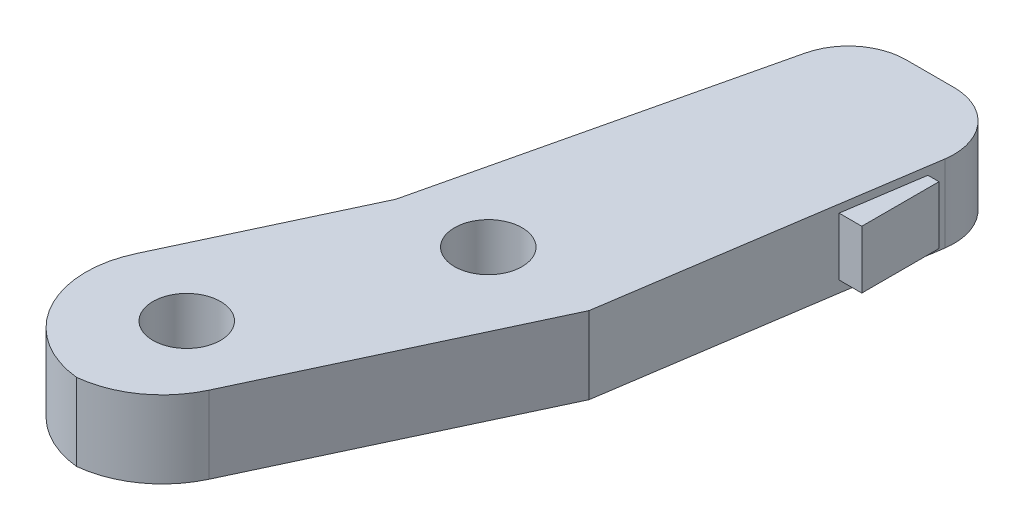
ISO-10303-21;
HEADER;
FILE_DESCRIPTION(('STEP AP214'),'2;1');
FILE_NAME('part.step','',(''),(''),'','','');
FILE_SCHEMA(('AUTOMOTIVE_DESIGN { 1 0 10303 214 1 1 1 1 }'));
ENDSEC;
DATA;
#1=APPLICATION_CONTEXT('core data for automotive mechanical design processes');
#2=APPLICATION_PROTOCOL_DEFINITION('international standard','automotive_design',2000,#1);
#3=PRODUCT_CONTEXT('',#1,'mechanical');
#4=PRODUCT('Part','Part','',(#3));
#5=PRODUCT_RELATED_PRODUCT_CATEGORY('part','',(#4));
#6=PRODUCT_DEFINITION_FORMATION('','',#4);
#7=PRODUCT_DEFINITION_CONTEXT('part definition',#1,'design');
#8=PRODUCT_DEFINITION('design','',#6,#7);
#9=PRODUCT_DEFINITION_SHAPE('','',#8);
#10=(LENGTH_UNIT() NAMED_UNIT(*) SI_UNIT(.MILLI.,.METRE.));
#11=(NAMED_UNIT(*) PLANE_ANGLE_UNIT() SI_UNIT($,.RADIAN.));
#12=(NAMED_UNIT(*) SI_UNIT($,.STERADIAN.) SOLID_ANGLE_UNIT());
#13=UNCERTAINTY_MEASURE_WITH_UNIT(LENGTH_MEASURE(1.E-05),#10,'distance_accuracy_value','');
#14=(GEOMETRIC_REPRESENTATION_CONTEXT(3) GLOBAL_UNCERTAINTY_ASSIGNED_CONTEXT((#13)) GLOBAL_UNIT_ASSIGNED_CONTEXT((#10,
#11,#12)) REPRESENTATION_CONTEXT('',''));
#15=CARTESIAN_POINT('',(0.,0.,0.));
#16=DIRECTION('',(0.,0.,1.));
#17=DIRECTION('',(1.,0.,0.));
#18=AXIS2_PLACEMENT_3D('',#15,#16,#17);
#19=CARTESIAN_POINT('',(17.6273199706348,4.,-16.3041096066469));
#20=DIRECTION('',(-0.905783867035938,0.,-0.423739998368602));
#21=DIRECTION('',(-0.423739998368602,0.,0.905783867035938));
#22=AXIS2_PLACEMENT_3D('',#19,#20,#21);
#23=PLANE('',#22);
#24=DIRECTION('',(0.423739998368602,0.,-0.905783867035938));
#25=VECTOR('',#24,1.);
#26=CARTESIAN_POINT('',(17.6273199706348,4.,-16.3041096066469));
#27=LINE('',#26,#25);
#28=CARTESIAN_POINT('',(11.3479176492194,4.,-2.88130000815699));
#29=VERTEX_POINT('',#28);
#30=CARTESIAN_POINT('',(17.6273199706348,4.,-16.3041096066469));
#31=VERTEX_POINT('',#30);
#32=EDGE_CURVE('E189',#29,#31,#27,.T.);
#33=ORIENTED_EDGE('',*,*,#32,.F.);
#34=DIRECTION('',(0.,-1.,0.));
#35=VECTOR('',#34,1.);
#36=CARTESIAN_POINT('',(11.3479176492194,4.,-2.88130000815699));
#37=LINE('',#36,#35);
#38=CARTESIAN_POINT('',(11.3479176492194,0.,-2.88130000815699));
#39=VERTEX_POINT('',#38);
#40=EDGE_CURVE('E231',#29,#39,#37,.T.);
#41=ORIENTED_EDGE('',*,*,#40,.T.);
#42=DIRECTION('',(0.423739998368602,0.,-0.905783867035938));
#43=VECTOR('',#42,1.);
#44=CARTESIAN_POINT('',(17.6273199706348,0.,-16.3041096066469));
#45=LINE('',#44,#43);
#46=CARTESIAN_POINT('',(17.6273199706348,0.,-16.3041096066469));
#47=VERTEX_POINT('',#46);
#48=EDGE_CURVE('E208',#39,#47,#45,.T.);
#49=ORIENTED_EDGE('',*,*,#48,.T.);
#50=DIRECTION('',(0.,-1.,0.));
#51=VECTOR('',#50,1.);
#52=CARTESIAN_POINT('',(17.6273199706348,4.,-16.3041096066469));
#53=LINE('',#52,#51);
#54=EDGE_CURVE('E227',#31,#47,#53,.T.);
#55=ORIENTED_EDGE('',*,*,#54,.F.);
#56=EDGE_LOOP('',(#33,#41,#49,#55));
#57=FACE_BOUND('',#56,.T.);
#58=ADVANCED_FACE('F39',(#57),#23,.F.);
#59=CARTESIAN_POINT('',(17.6273199706348,4.,-16.3041096066469));
#60=DIRECTION('',(-0.988843676353999,0.,-0.148956986189662));
#61=DIRECTION('',(-0.148956986189662,0.,0.988843676353999));
#62=AXIS2_PLACEMENT_3D('',#59,#60,#61);
#63=PLANE('',#62);
#64=DIRECTION('',(0.,-1.,0.));
#65=VECTOR('',#64,1.);
#66=CARTESIAN_POINT('',(19.3230465241798,3.5919262154066,-27.5611074970548));
#67=LINE('',#66,#65);
#68=CARTESIAN_POINT('',(19.3230465241798,3.5919262154066,-27.5611074970548));
#69=VERTEX_POINT('',#68);
#70=CARTESIAN_POINT('',(19.3230465241798,0.591926215406602,-27.5611074970548));
#71=VERTEX_POINT('',#70);
#72=EDGE_CURVE('E139',#69,#71,#67,.T.);
#73=ORIENTED_EDGE('',*,*,#72,.F.);
#74=DIRECTION('',(-0.148956986189662,0.,0.988843676353999));
#75=VECTOR('',#74,1.);
#76=CARTESIAN_POINT('',(19.8073452196943,3.5919262154066,-30.7761007295052));
#77=LINE('',#76,#75);
#78=CARTESIAN_POINT('',(19.9255967138676,3.5919262154066,-31.5611074970548));
#79=VERTEX_POINT('',#78);
#80=EDGE_CURVE('E146',#79,#69,#77,.T.);
#81=ORIENTED_EDGE('',*,*,#80,.F.);
#82=DIRECTION('',(0.,1.,0.));
#83=VECTOR('',#82,1.);
#84=CARTESIAN_POINT('',(19.9255967138676,3.5919262154066,-31.5611074970548));
#85=LINE('',#84,#83);
#86=CARTESIAN_POINT('',(19.9255967138676,0.591926215406602,-31.5611074970548));
#87=VERTEX_POINT('',#86);
#88=EDGE_CURVE('E168',#87,#79,#85,.T.);
#89=ORIENTED_EDGE('',*,*,#88,.F.);
#90=DIRECTION('',(0.148956986189662,0.,-0.988843676353999));
#91=VECTOR('',#90,1.);
#92=CARTESIAN_POINT('',(19.8073452196943,0.591926215406602,-30.7761007295052));
#93=LINE('',#92,#91);
#94=EDGE_CURVE('E55',#71,#87,#93,.T.);
#95=ORIENTED_EDGE('',*,*,#94,.F.);
#96=EDGE_LOOP('',(#73,#81,#89,#95));
#97=FACE_BOUND('',#96,.T.);
#98=DIRECTION('',(0.148956986189662,0.,-0.988843676353999));
#99=VECTOR('',#98,1.);
#100=CARTESIAN_POINT('',(17.6273199706348,0.,-16.3041096066469));
#101=LINE('',#100,#99);
#102=CARTESIAN_POINT('',(20.0405364831283,0.,-32.3241295405482));
#103=VERTEX_POINT('',#102);
#104=EDGE_CURVE('E211',#47,#103,#101,.T.);
#105=ORIENTED_EDGE('',*,*,#104,.T.);
#106=DIRECTION('',(0.,-1.,0.));
#107=VECTOR('',#106,1.);
#108=CARTESIAN_POINT('',(20.0405364831283,4.,-32.3241295405482));
#109=LINE('',#108,#107);
#110=CARTESIAN_POINT('',(20.0405364831283,4.,-32.3241295405482));
#111=VERTEX_POINT('',#110);
#112=EDGE_CURVE('E11',#103,#111,#109,.F.);
#113=ORIENTED_EDGE('',*,*,#112,.T.);
#114=DIRECTION('',(0.148956986189662,0.,-0.988843676353999));
#115=VECTOR('',#114,1.);
#116=CARTESIAN_POINT('',(17.6273199706348,4.,-16.3041096066469));
#117=LINE('',#116,#115);
#118=EDGE_CURVE('E192',#31,#111,#117,.T.);
#119=ORIENTED_EDGE('',*,*,#118,.F.);
#120=ORIENTED_EDGE('',*,*,#54,.T.);
#121=EDGE_LOOP('',(#105,#113,#119,#120));
#122=FACE_BOUND('',#121,.T.);
#123=ADVANCED_FACE('F157',(#97,#122),#63,.F.);
#124=CARTESIAN_POINT('',(20.5597646706071,4.,-35.7710004991172));
#125=DIRECTION('',(0.,0.,1.));
#126=DIRECTION('',(1.,0.,0.));
#127=AXIS2_PLACEMENT_3D('',#124,#125,#126);
#128=PLANE('',#127);
#129=DIRECTION('',(-1.,0.,0.));
#130=VECTOR('',#129,1.);
#131=CARTESIAN_POINT('',(20.5597646706071,0.,-35.7710004991172));
#132=LINE('',#131,#130);
#133=CARTESIAN_POINT('',(17.0740054540663,0.,-35.7710004991172));
#134=VERTEX_POINT('',#133);
#135=CARTESIAN_POINT('',(14.5895459009964,0.,-35.7710004991172));
#136=VERTEX_POINT('',#135);
#137=EDGE_CURVE('E214',#134,#136,#132,.T.);
#138=ORIENTED_EDGE('',*,*,#137,.T.);
#139=DIRECTION('',(0.,-1.,0.));
#140=VECTOR('',#139,1.);
#141=CARTESIAN_POINT('',(14.5895459009964,4.,-35.7710004991172));
#142=LINE('',#141,#140);
#143=CARTESIAN_POINT('',(14.5895459009964,4.,-35.7710004991172));
#144=VERTEX_POINT('',#143);
#145=EDGE_CURVE('E267',#136,#144,#142,.F.);
#146=ORIENTED_EDGE('',*,*,#145,.T.);
#147=DIRECTION('',(-1.,0.,0.));
#148=VECTOR('',#147,1.);
#149=CARTESIAN_POINT('',(20.5597646706071,4.,-35.7710004991172));
#150=LINE('',#149,#148);
#151=CARTESIAN_POINT('',(17.0740054540663,4.,-35.7710004991172));
#152=VERTEX_POINT('',#151);
#153=EDGE_CURVE('E196',#152,#144,#150,.T.);
#154=ORIENTED_EDGE('',*,*,#153,.F.);
#155=DIRECTION('',(0.,-1.,0.));
#156=VECTOR('',#155,1.);
#157=CARTESIAN_POINT('',(17.0740054540663,4.,-35.7710004991172));
#158=LINE('',#157,#156);
#159=EDGE_CURVE('E263',#152,#134,#158,.T.);
#160=ORIENTED_EDGE('',*,*,#159,.T.);
#161=EDGE_LOOP('',(#138,#146,#154,#160));
#162=FACE_BOUND('',#161,.T.);
#163=ADVANCED_FACE('F292',(#162),#128,.F.);
#164=CARTESIAN_POINT('',(7.62731997063483,4.,-16.3041096066469));
#165=DIRECTION('',(0.973344544623518,0.,0.229347765307703));
#166=DIRECTION('',(0.229347765307703,0.,-0.973344544623518));
#167=AXIS2_PLACEMENT_3D('',#164,#165,#166);
#168=PLANE('',#167);
#169=DIRECTION('',(-0.229347765307703,0.,0.973344544623517));
#170=VECTOR('',#169,1.);
#171=CARTESIAN_POINT('',(7.62731997063483,4.,-16.3041096066469));
#172=LINE('',#171,#170);
#173=CARTESIAN_POINT('',(11.6695122671259,4.,-33.4590437950403));
#174=VERTEX_POINT('',#173);
#175=CARTESIAN_POINT('',(7.62731997063483,4.,-16.3041096066469));
#176=VERTEX_POINT('',#175);
#177=EDGE_CURVE('E200',#174,#176,#172,.T.);
#178=ORIENTED_EDGE('',*,*,#177,.F.);
#179=DIRECTION('',(0.,-1.,0.));
#180=VECTOR('',#179,1.);
#181=CARTESIAN_POINT('',(11.6695122671259,4.,-33.4590437950403));
#182=LINE('',#181,#180);
#183=CARTESIAN_POINT('',(11.6695122671259,0.,-33.4590437950403));
#184=VERTEX_POINT('',#183);
#185=EDGE_CURVE('E250',#174,#184,#182,.T.);
#186=ORIENTED_EDGE('',*,*,#185,.T.);
#187=DIRECTION('',(-0.229347765307703,0.,0.973344544623517));
#188=VECTOR('',#187,1.);
#189=CARTESIAN_POINT('',(7.62731997063483,0.,-16.3041096066469));
#190=LINE('',#189,#188);
#191=CARTESIAN_POINT('',(7.62731997063483,0.,-16.3041096066469));
#192=VERTEX_POINT('',#191);
#193=EDGE_CURVE('E218',#184,#192,#190,.T.);
#194=ORIENTED_EDGE('',*,*,#193,.T.);
#195=DIRECTION('',(0.,-1.,0.));
#196=VECTOR('',#195,1.);
#197=CARTESIAN_POINT('',(7.62731997063483,4.,-16.3041096066469));
#198=LINE('',#197,#196);
#199=EDGE_CURVE('E207',#176,#192,#198,.T.);
#200=ORIENTED_EDGE('',*,*,#199,.F.);
#201=EDGE_LOOP('',(#178,#186,#194,#200));
#202=FACE_BOUND('',#201,.T.);
#203=ADVANCED_FACE('F283',(#202),#168,.F.);
#204=CARTESIAN_POINT('',(0.,4.,0.));
#205=DIRECTION('',(0.905783867035938,0.,0.423739998368602));
#206=DIRECTION('',(0.423739998368602,0.,-0.905783867035938));
#207=AXIS2_PLACEMENT_3D('',#204,#205,#206);
#208=PLANE('',#207);
#209=DIRECTION('',(-0.423739998368602,0.,0.905783867035938));
#210=VECTOR('',#209,1.);
#211=CARTESIAN_POINT('',(0.,0.,0.));
#212=LINE('',#211,#210);
#213=CARTESIAN_POINT('',(3.33024028436404,0.,-7.11869999184301));
#214=VERTEX_POINT('',#213);
#215=EDGE_CURVE('E193',#192,#214,#212,.T.);
#216=ORIENTED_EDGE('',*,*,#215,.T.);
#217=DIRECTION('',(0.,-1.,0.));
#218=VECTOR('',#217,1.);
#219=CARTESIAN_POINT('',(3.33024028436404,4.,-7.11869999184301));
#220=LINE('',#219,#218);
#221=CARTESIAN_POINT('',(3.33024028436404,4.,-7.11869999184301));
#222=VERTEX_POINT('',#221);
#223=EDGE_CURVE('E247',#214,#222,#220,.F.);
#224=ORIENTED_EDGE('',*,*,#223,.T.);
#225=DIRECTION('',(-0.423739998368602,0.,0.905783867035938));
#226=VECTOR('',#225,1.);
#227=CARTESIAN_POINT('',(0.,4.,0.));
#228=LINE('',#227,#226);
#229=EDGE_CURVE('E203',#176,#222,#228,.T.);
#230=ORIENTED_EDGE('',*,*,#229,.F.);
#231=ORIENTED_EDGE('',*,*,#199,.T.);
#232=EDGE_LOOP('',(#216,#224,#230,#231));
#233=FACE_BOUND('',#232,.T.);
#234=ADVANCED_FACE('F312',(#233),#208,.F.);
#235=CARTESIAN_POINT('',(0.,4.,0.));
#236=DIRECTION('',(0.,-1.,0.));
#237=DIRECTION('',(0.,0.,-1.));
#238=AXIS2_PLACEMENT_3D('',#235,#236,#237);
#239=PLANE('',#238);
#240=CARTESIAN_POINT('',(7.66771158481618,4.,-5.413915861948));
#241=DIRECTION('',(0.,1.,0.));
#242=DIRECTION('',(0.,0.,1.));
#243=AXIS2_PLACEMENT_3D('',#240,#241,#242);
#244=CIRCLE('',#243,1.75);
#245=CARTESIAN_POINT('',(7.66771158481618,4.,-3.663915861948));
#246=VERTEX_POINT('',#245);
#247=EDGE_CURVE('E178',#246,#246,#244,.T.);
#248=ORIENTED_EDGE('',*,*,#247,.F.);
#249=EDGE_LOOP('',(#248));
#250=FACE_BOUND('',#249,.T.);
#251=CARTESIAN_POINT('',(12.1700246776144,4.,-16.5372776206259));
#252=DIRECTION('',(0.,1.,0.));
#253=DIRECTION('',(0.,0.,1.));
#254=AXIS2_PLACEMENT_3D('',#251,#252,#253);
#255=CIRCLE('',#254,1.75);
#256=CARTESIAN_POINT('',(12.1700246776144,4.,-14.7872776206259));
#257=VERTEX_POINT('',#256);
#258=EDGE_CURVE('E172',#257,#257,#255,.T.);
#259=ORIENTED_EDGE('',*,*,#258,.F.);
#260=EDGE_LOOP('',(#259));
#261=FACE_BOUND('',#260,.T.);
#262=ORIENTED_EDGE('',*,*,#153,.T.);
#263=CARTESIAN_POINT('',(14.5895459009964,4.,-32.7710004991172));
#264=DIRECTION('',(0.,-1.,0.));
#265=DIRECTION('',(0.,0.,-1.));
#266=AXIS2_PLACEMENT_3D('',#263,#264,#265);
#267=CIRCLE('',#266,3.);
#268=EDGE_CURVE('E48',#144,#174,#267,.F.);
#269=ORIENTED_EDGE('',*,*,#268,.T.);
#270=ORIENTED_EDGE('',*,*,#177,.T.);
#271=ORIENTED_EDGE('',*,*,#229,.T.);
#272=CARTESIAN_POINT('',(7.85915961954373,4.,-5.));
#273=DIRECTION('',(0.,-1.,0.));
#274=DIRECTION('',(0.,0.,-1.));
#275=AXIS2_PLACEMENT_3D('',#272,#273,#274);
#276=CIRCLE('',#275,5.);
#277=CARTESIAN_POINT('',(7.33907896679169,4.,-0.0271219485459915));
#278=VERTEX_POINT('',#277);
#279=EDGE_CURVE('E241',#222,#278,#276,.F.);
#280=ORIENTED_EDGE('',*,*,#279,.T.);
#281=CARTESIAN_POINT('',(6.81899831403967,4.,-5.));
#282=DIRECTION('',(0.,-1.,0.));
#283=DIRECTION('',(0.,0.,-1.));
#284=AXIS2_PLACEMENT_3D('',#281,#282,#283);
#285=CIRCLE('',#284,5.);
#286=EDGE_CURVE('E244',#278,#29,#285,.F.);
#287=ORIENTED_EDGE('',*,*,#286,.T.);
#288=ORIENTED_EDGE('',*,*,#32,.T.);
#289=ORIENTED_EDGE('',*,*,#118,.T.);
#290=CARTESIAN_POINT('',(17.0740054540663,4.,-32.7710004991172));
#291=DIRECTION('',(0.,-1.,0.));
#292=DIRECTION('',(0.,0.,-1.));
#293=AXIS2_PLACEMENT_3D('',#290,#291,#292);
#294=CIRCLE('',#293,3.);
#295=EDGE_CURVE('E270',#111,#152,#294,.F.);
#296=ORIENTED_EDGE('',*,*,#295,.T.);
#297=EDGE_LOOP('',(#262,#269,#270,#271,#280,#287,#288,#289,#296));
#298=FACE_BOUND('',#297,.T.);
#299=ADVANCED_FACE('F276',(#250,#261,#298),#239,.F.);
#300=CARTESIAN_POINT('',(0.,0.,0.));
#301=DIRECTION('',(0.,-1.,0.));
#302=DIRECTION('',(0.,0.,-1.));
#303=AXIS2_PLACEMENT_3D('',#300,#301,#302);
#304=PLANE('',#303);
#305=CARTESIAN_POINT('',(7.66771158481618,0.,-5.413915861948));
#306=DIRECTION('',(0.,1.,0.));
#307=DIRECTION('',(0.,0.,1.));
#308=AXIS2_PLACEMENT_3D('',#305,#306,#307);
#309=CIRCLE('',#308,1.75);
#310=CARTESIAN_POINT('',(7.66771158481618,0.,-3.663915861948));
#311=VERTEX_POINT('',#310);
#312=EDGE_CURVE('E173',#311,#311,#309,.T.);
#313=ORIENTED_EDGE('',*,*,#312,.T.);
#314=EDGE_LOOP('',(#313));
#315=FACE_BOUND('',#314,.T.);
#316=CARTESIAN_POINT('',(12.1700246776144,0.,-16.5372776206259));
#317=DIRECTION('',(0.,1.,0.));
#318=DIRECTION('',(0.,0.,1.));
#319=AXIS2_PLACEMENT_3D('',#316,#317,#318);
#320=CIRCLE('',#319,1.75);
#321=CARTESIAN_POINT('',(12.1700246776144,0.,-14.7872776206259));
#322=VERTEX_POINT('',#321);
#323=EDGE_CURVE('E182',#322,#322,#320,.T.);
#324=ORIENTED_EDGE('',*,*,#323,.T.);
#325=EDGE_LOOP('',(#324));
#326=FACE_BOUND('',#325,.T.);
#327=ORIENTED_EDGE('',*,*,#193,.F.);
#328=CARTESIAN_POINT('',(14.5895459009964,0.,-32.7710004991172));
#329=DIRECTION('',(0.,-1.,0.));
#330=DIRECTION('',(0.,0.,-1.));
#331=AXIS2_PLACEMENT_3D('',#328,#329,#330);
#332=CIRCLE('',#331,3.);
#333=EDGE_CURVE('E260',#184,#136,#332,.T.);
#334=ORIENTED_EDGE('',*,*,#333,.T.);
#335=ORIENTED_EDGE('',*,*,#137,.F.);
#336=CARTESIAN_POINT('',(17.0740054540663,0.,-32.7710004991172));
#337=DIRECTION('',(0.,-1.,0.));
#338=DIRECTION('',(0.,0.,-1.));
#339=AXIS2_PLACEMENT_3D('',#336,#337,#338);
#340=CIRCLE('',#339,3.);
#341=EDGE_CURVE('E257',#134,#103,#340,.T.);
#342=ORIENTED_EDGE('',*,*,#341,.T.);
#343=ORIENTED_EDGE('',*,*,#104,.F.);
#344=ORIENTED_EDGE('',*,*,#48,.F.);
#345=CARTESIAN_POINT('',(6.81899831403967,0.,-5.));
#346=DIRECTION('',(0.,-1.,0.));
#347=DIRECTION('',(0.,0.,-1.));
#348=AXIS2_PLACEMENT_3D('',#345,#346,#347);
#349=CIRCLE('',#348,5.);
#350=CARTESIAN_POINT('',(7.33907896679169,0.,-0.0271219485459915));
#351=VERTEX_POINT('',#350);
#352=EDGE_CURVE('E238',#39,#351,#349,.T.);
#353=ORIENTED_EDGE('',*,*,#352,.T.);
#354=CARTESIAN_POINT('',(7.85915961954373,0.,-5.));
#355=DIRECTION('',(0.,-1.,0.));
#356=DIRECTION('',(0.,0.,-1.));
#357=AXIS2_PLACEMENT_3D('',#354,#355,#356);
#358=CIRCLE('',#357,5.);
#359=EDGE_CURVE('E235',#351,#214,#358,.T.);
#360=ORIENTED_EDGE('',*,*,#359,.T.);
#361=ORIENTED_EDGE('',*,*,#215,.F.);
#362=EDGE_LOOP('',(#327,#334,#335,#342,#343,#344,#353,#360,#361));
#363=FACE_BOUND('',#362,.T.);
#364=ADVANCED_FACE('F289',(#315,#326,#363),#304,.T.);
#365=CARTESIAN_POINT('',(7.85915961954373,4.,-5.));
#366=DIRECTION('',(0.,-1.,0.));
#367=DIRECTION('',(0.,0.,-1.));
#368=AXIS2_PLACEMENT_3D('',#365,#366,#367);
#369=CYLINDRICAL_SURFACE('',#368,5.);
#370=DIRECTION('',(0.,-1.,0.));
#371=VECTOR('',#370,1.);
#372=CARTESIAN_POINT('',(7.33907896679169,2.,-0.0271219485459915));
#373=LINE('',#372,#371);
#374=EDGE_CURVE('E177',#278,#351,#373,.T.);
#375=ORIENTED_EDGE('',*,*,#374,.F.);
#376=ORIENTED_EDGE('',*,*,#279,.F.);
#377=ORIENTED_EDGE('',*,*,#223,.F.);
#378=ORIENTED_EDGE('',*,*,#359,.F.);
#379=EDGE_LOOP('',(#375,#376,#377,#378));
#380=FACE_BOUND('',#379,.T.);
#381=ADVANCED_FACE('F307',(#380),#369,.T.);
#382=CARTESIAN_POINT('',(6.81899831403967,4.,-5.));
#383=DIRECTION('',(0.,-1.,0.));
#384=DIRECTION('',(0.,0.,-1.));
#385=AXIS2_PLACEMENT_3D('',#382,#383,#384);
#386=CYLINDRICAL_SURFACE('',#385,5.);
#387=ORIENTED_EDGE('',*,*,#286,.F.);
#388=ORIENTED_EDGE('',*,*,#374,.T.);
#389=ORIENTED_EDGE('',*,*,#352,.F.);
#390=ORIENTED_EDGE('',*,*,#40,.F.);
#391=EDGE_LOOP('',(#387,#388,#389,#390));
#392=FACE_BOUND('',#391,.T.);
#393=ADVANCED_FACE('F310',(#392),#386,.T.);
#394=CARTESIAN_POINT('',(14.5895459009964,4.,-32.7710004991172));
#395=DIRECTION('',(0.,-1.,0.));
#396=DIRECTION('',(0.,0.,-1.));
#397=AXIS2_PLACEMENT_3D('',#394,#395,#396);
#398=CYLINDRICAL_SURFACE('',#397,3.);
#399=ORIENTED_EDGE('',*,*,#268,.F.);
#400=ORIENTED_EDGE('',*,*,#145,.F.);
#401=ORIENTED_EDGE('',*,*,#333,.F.);
#402=ORIENTED_EDGE('',*,*,#185,.F.);
#403=EDGE_LOOP('',(#399,#400,#401,#402));
#404=FACE_BOUND('',#403,.T.);
#405=ADVANCED_FACE('F286',(#404),#398,.T.);
#406=CARTESIAN_POINT('',(17.0740054540663,4.,-32.7710004991172));
#407=DIRECTION('',(0.,-1.,0.));
#408=DIRECTION('',(0.,0.,-1.));
#409=AXIS2_PLACEMENT_3D('',#406,#407,#408);
#410=CYLINDRICAL_SURFACE('',#409,3.);
#411=ORIENTED_EDGE('',*,*,#295,.F.);
#412=ORIENTED_EDGE('',*,*,#112,.F.);
#413=ORIENTED_EDGE('',*,*,#341,.F.);
#414=ORIENTED_EDGE('',*,*,#159,.F.);
#415=EDGE_LOOP('',(#411,#412,#413,#414));
#416=FACE_BOUND('',#415,.T.);
#417=ADVANCED_FACE('F41',(#416),#410,.T.);
#418=CARTESIAN_POINT('',(12.1700246776144,0.,-16.5372776206259));
#419=DIRECTION('',(0.,1.,0.));
#420=DIRECTION('',(0.,0.,1.));
#421=AXIS2_PLACEMENT_3D('',#418,#419,#420);
#422=CYLINDRICAL_SURFACE('',#421,1.75);
#423=ORIENTED_EDGE('',*,*,#323,.F.);
#424=EDGE_LOOP('',(#423));
#425=FACE_BOUND('',#424,.T.);
#426=ORIENTED_EDGE('',*,*,#258,.T.);
#427=EDGE_LOOP('',(#426));
#428=FACE_BOUND('',#427,.T.);
#429=ADVANCED_FACE('F340',(#425,#428),#422,.F.);
#430=CARTESIAN_POINT('',(7.66771158481618,0.,-5.413915861948));
#431=DIRECTION('',(0.,1.,0.));
#432=DIRECTION('',(0.,0.,1.));
#433=AXIS2_PLACEMENT_3D('',#430,#431,#432);
#434=CYLINDRICAL_SURFACE('',#433,1.75);
#435=ORIENTED_EDGE('',*,*,#312,.F.);
#436=EDGE_LOOP('',(#435));
#437=FACE_BOUND('',#436,.T.);
#438=ORIENTED_EDGE('',*,*,#247,.T.);
#439=EDGE_LOOP('',(#438));
#440=FACE_BOUND('',#439,.T.);
#441=ADVANCED_FACE('F344',(#437,#440),#434,.F.);
#442=CARTESIAN_POINT('',(20.5,0.,0.));
#443=DIRECTION('',(-1.,0.,0.));
#444=DIRECTION('',(0.,0.,1.));
#445=AXIS2_PLACEMENT_3D('',#442,#443,#444);
#446=PLANE('',#445);
#447=DIRECTION('',(0.,1.,0.));
#448=VECTOR('',#447,1.);
#449=CARTESIAN_POINT('',(20.5,3.5919262154066,-31.5611074970548));
#450=LINE('',#449,#448);
#451=CARTESIAN_POINT('',(20.5,0.591926215406602,-31.5611074970548));
#452=VERTEX_POINT('',#451);
#453=CARTESIAN_POINT('',(20.5,3.5919262154066,-31.5611074970548));
#454=VERTEX_POINT('',#453);
#455=EDGE_CURVE('E429',#452,#454,#450,.T.);
#456=ORIENTED_EDGE('',*,*,#455,.T.);
#457=DIRECTION('',(0.,0.,1.));
#458=VECTOR('',#457,1.);
#459=CARTESIAN_POINT('',(20.5,3.5919262154066,-31.5611074970548));
#460=LINE('',#459,#458);
#461=CARTESIAN_POINT('',(20.5,3.5919262154066,-27.5611074970548));
#462=VERTEX_POINT('',#461);
#463=EDGE_CURVE('E436',#454,#462,#460,.T.);
#464=ORIENTED_EDGE('',*,*,#463,.T.);
#465=DIRECTION('',(0.,-1.,0.));
#466=VECTOR('',#465,1.);
#467=CARTESIAN_POINT('',(20.5,3.5919262154066,-27.5611074970548));
#468=LINE('',#467,#466);
#469=CARTESIAN_POINT('',(20.5,0.591926215406602,-27.5611074970548));
#470=VERTEX_POINT('',#469);
#471=EDGE_CURVE('E141',#462,#470,#468,.T.);
#472=ORIENTED_EDGE('',*,*,#471,.T.);
#473=DIRECTION('',(0.,0.,-1.));
#474=VECTOR('',#473,1.);
#475=CARTESIAN_POINT('',(20.5,0.591926215406602,-31.5611074970548));
#476=LINE('',#475,#474);
#477=EDGE_CURVE('E155',#470,#452,#476,.T.);
#478=ORIENTED_EDGE('',*,*,#477,.T.);
#479=EDGE_LOOP('',(#456,#464,#472,#478));
#480=FACE_BOUND('',#479,.T.);
#481=ADVANCED_FACE('F350',(#480),#446,.F.);
#482=CARTESIAN_POINT('',(14.5961161404613,3.5919262154066,-31.5611074970548));
#483=DIRECTION('',(0.,1.,0.));
#484=DIRECTION('',(0.,0.,1.));
#485=AXIS2_PLACEMENT_3D('',#482,#483,#484);
#486=PLANE('',#485);
#487=DIRECTION('',(1.,0.,0.));
#488=VECTOR('',#487,1.);
#489=CARTESIAN_POINT('',(14.5961161404613,3.5919262154066,-31.5611074970548));
#490=LINE('',#489,#488);
#491=EDGE_CURVE('E151',#79,#454,#490,.T.);
#492=ORIENTED_EDGE('',*,*,#491,.F.);
#493=ORIENTED_EDGE('',*,*,#80,.T.);
#494=DIRECTION('',(1.,0.,0.));
#495=VECTOR('',#494,1.);
#496=CARTESIAN_POINT('',(14.5961161404613,3.5919262154066,-27.5611074970548));
#497=LINE('',#496,#495);
#498=EDGE_CURVE('E135',#69,#462,#497,.T.);
#499=ORIENTED_EDGE('',*,*,#498,.T.);
#500=ORIENTED_EDGE('',*,*,#463,.F.);
#501=EDGE_LOOP('',(#492,#493,#499,#500));
#502=FACE_BOUND('',#501,.T.);
#503=ADVANCED_FACE('F150',(#502),#486,.T.);
#504=CARTESIAN_POINT('',(14.5961161404613,3.5919262154066,-27.5611074970548));
#505=DIRECTION('',(0.,0.,1.));
#506=DIRECTION('',(1.,0.,0.));
#507=AXIS2_PLACEMENT_3D('',#504,#505,#506);
#508=PLANE('',#507);
#509=ORIENTED_EDGE('',*,*,#498,.F.);
#510=ORIENTED_EDGE('',*,*,#72,.T.);
#511=DIRECTION('',(1.,0.,0.));
#512=VECTOR('',#511,1.);
#513=CARTESIAN_POINT('',(14.5961161404613,0.591926215406602,-27.5611074970548));
#514=LINE('',#513,#512);
#515=EDGE_CURVE('E159',#71,#470,#514,.T.);
#516=ORIENTED_EDGE('',*,*,#515,.T.);
#517=ORIENTED_EDGE('',*,*,#471,.F.);
#518=EDGE_LOOP('',(#509,#510,#516,#517));
#519=FACE_BOUND('',#518,.T.);
#520=ADVANCED_FACE('F137',(#519),#508,.T.);
#521=CARTESIAN_POINT('',(14.5961161404613,0.591926215406602,-31.5611074970548));
#522=DIRECTION('',(0.,-1.,0.));
#523=DIRECTION('',(0.,0.,-1.));
#524=AXIS2_PLACEMENT_3D('',#521,#522,#523);
#525=PLANE('',#524);
#526=ORIENTED_EDGE('',*,*,#515,.F.);
#527=ORIENTED_EDGE('',*,*,#94,.T.);
#528=DIRECTION('',(1.,0.,0.));
#529=VECTOR('',#528,1.);
#530=CARTESIAN_POINT('',(14.5961161404613,0.591926215406602,-31.5611074970548));
#531=LINE('',#530,#529);
#532=EDGE_CURVE('E166',#87,#452,#531,.T.);
#533=ORIENTED_EDGE('',*,*,#532,.T.);
#534=ORIENTED_EDGE('',*,*,#477,.F.);
#535=EDGE_LOOP('',(#526,#527,#533,#534));
#536=FACE_BOUND('',#535,.T.);
#537=ADVANCED_FACE('F405',(#536),#525,.T.);
#538=CARTESIAN_POINT('',(14.5961161404613,3.5919262154066,-31.5611074970548));
#539=DIRECTION('',(0.,0.,-1.));
#540=DIRECTION('',(-1.,0.,0.));
#541=AXIS2_PLACEMENT_3D('',#538,#539,#540);
#542=PLANE('',#541);
#543=ORIENTED_EDGE('',*,*,#532,.F.);
#544=ORIENTED_EDGE('',*,*,#88,.T.);
#545=ORIENTED_EDGE('',*,*,#491,.T.);
#546=ORIENTED_EDGE('',*,*,#455,.F.);
#547=EDGE_LOOP('',(#543,#544,#545,#546));
#548=FACE_BOUND('',#547,.T.);
#549=ADVANCED_FACE('F414',(#548),#542,.T.);
#550=CLOSED_SHELL('',(#58,#123,#163,#203,#234,#299,#364,#381,#393,#405,#417,#429,#441,#481,#503,
#520,#537,#549));
#551=MANIFOLD_SOLID_BREP('B2',#550);
#552=ADVANCED_BREP_SHAPE_REPRESENTATION('',(#18,#551),#14);
#553=SHAPE_DEFINITION_REPRESENTATION(#9,#552);
ENDSEC;
END-ISO-10303-21;
